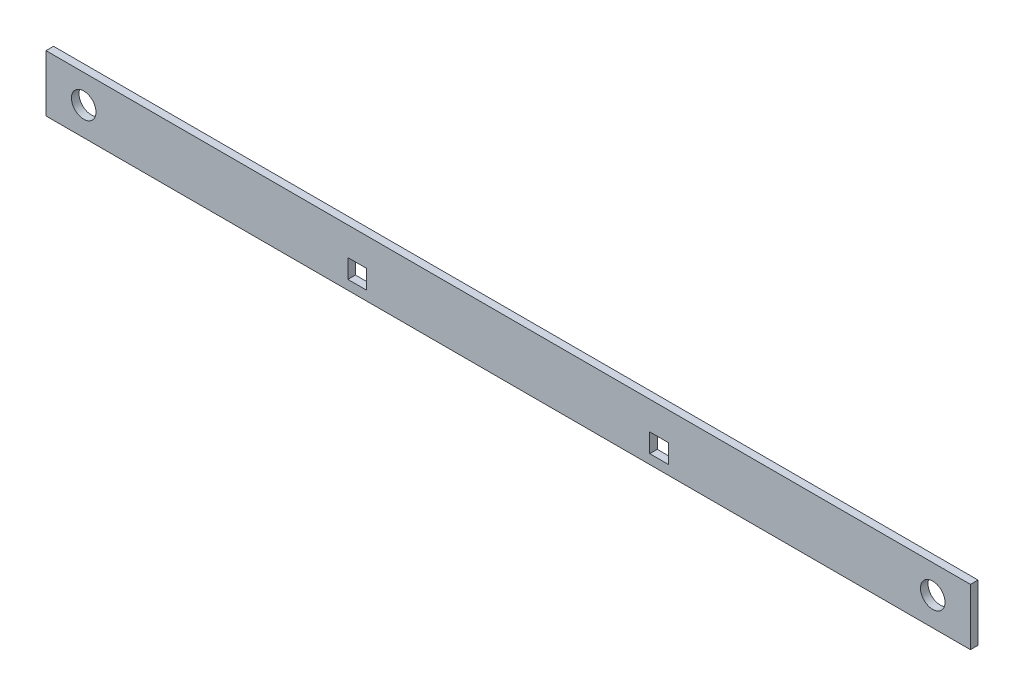
ISO-10303-21;
HEADER;
FILE_DESCRIPTION(('STEP AP214'),'2;1');
FILE_NAME('part.step','',(''),(''),'','','');
FILE_SCHEMA(('AUTOMOTIVE_DESIGN { 1 0 10303 214 1 1 1 1 }'));
ENDSEC;
DATA;
#1=APPLICATION_CONTEXT('core data for automotive mechanical design processes');
#2=APPLICATION_PROTOCOL_DEFINITION('international standard','automotive_design',2000,#1);
#3=PRODUCT_CONTEXT('',#1,'mechanical');
#4=PRODUCT('Part','Part','',(#3));
#5=PRODUCT_RELATED_PRODUCT_CATEGORY('part','',(#4));
#6=PRODUCT_DEFINITION_FORMATION('','',#4);
#7=PRODUCT_DEFINITION_CONTEXT('part definition',#1,'design');
#8=PRODUCT_DEFINITION('design','',#6,#7);
#9=PRODUCT_DEFINITION_SHAPE('','',#8);
#10=(LENGTH_UNIT() NAMED_UNIT(*) SI_UNIT(.MILLI.,.METRE.));
#11=(NAMED_UNIT(*) PLANE_ANGLE_UNIT() SI_UNIT($,.RADIAN.));
#12=(NAMED_UNIT(*) SI_UNIT($,.STERADIAN.) SOLID_ANGLE_UNIT());
#13=UNCERTAINTY_MEASURE_WITH_UNIT(LENGTH_MEASURE(1.E-05),#10,'distance_accuracy_value','');
#14=(GEOMETRIC_REPRESENTATION_CONTEXT(3) GLOBAL_UNCERTAINTY_ASSIGNED_CONTEXT((#13)) GLOBAL_UNIT_ASSIGNED_CONTEXT((#10,
#11,#12)) REPRESENTATION_CONTEXT('',''));
#15=CARTESIAN_POINT('',(0.,0.,0.));
#16=DIRECTION('',(0.,0.,1.));
#17=DIRECTION('',(1.,0.,0.));
#18=AXIS2_PLACEMENT_3D('',#15,#16,#17);
#19=CARTESIAN_POINT('',(0.,0.,2.));
#20=DIRECTION('',(0.,0.,-1.));
#21=DIRECTION('',(-1.,0.,0.));
#22=AXIS2_PLACEMENT_3D('',#19,#20,#21);
#23=PLANE('',#22);
#24=DIRECTION('',(-1.,0.,0.));
#25=VECTOR('',#24,1.);
#26=CARTESIAN_POINT('',(-42.5,0.,2.));
#27=LINE('',#26,#25);
#28=CARTESIAN_POINT('',(-37.5,0.,2.));
#29=VERTEX_POINT('',#28);
#30=CARTESIAN_POINT('',(-42.5,0.,2.));
#31=VERTEX_POINT('',#30);
#32=EDGE_CURVE('E150',#29,#31,#27,.T.);
#33=ORIENTED_EDGE('',*,*,#32,.F.);
#34=DIRECTION('',(0.,1.,0.));
#35=VECTOR('',#34,1.);
#36=CARTESIAN_POINT('',(-37.5,-5.,2.));
#37=LINE('',#36,#35);
#38=CARTESIAN_POINT('',(-37.5,-5.,2.));
#39=VERTEX_POINT('',#38);
#40=EDGE_CURVE('E59',#39,#29,#37,.T.);
#41=ORIENTED_EDGE('',*,*,#40,.F.);
#42=DIRECTION('',(1.,0.,0.));
#43=VECTOR('',#42,1.);
#44=CARTESIAN_POINT('',(-42.5,-5.,2.));
#45=LINE('',#44,#43);
#46=CARTESIAN_POINT('',(-42.5,-5.,2.));
#47=VERTEX_POINT('',#46);
#48=EDGE_CURVE('E157',#47,#39,#45,.T.);
#49=ORIENTED_EDGE('',*,*,#48,.F.);
#50=DIRECTION('',(0.,-1.,0.));
#51=VECTOR('',#50,1.);
#52=CARTESIAN_POINT('',(-42.5,-5.,2.));
#53=LINE('',#52,#51);
#54=EDGE_CURVE('E139',#31,#47,#53,.T.);
#55=ORIENTED_EDGE('',*,*,#54,.F.);
#56=EDGE_LOOP('',(#33,#41,#49,#55));
#57=FACE_BOUND('',#56,.T.);
#58=DIRECTION('',(-1.,0.,0.));
#59=VECTOR('',#58,1.);
#60=CARTESIAN_POINT('',(37.5,0.,2.));
#61=LINE('',#60,#59);
#62=CARTESIAN_POINT('',(42.5,0.,2.));
#63=VERTEX_POINT('',#62);
#64=CARTESIAN_POINT('',(37.5,0.,2.));
#65=VERTEX_POINT('',#64);
#66=EDGE_CURVE('E193',#63,#65,#61,.T.);
#67=ORIENTED_EDGE('',*,*,#66,.F.);
#68=DIRECTION('',(0.,1.,0.));
#69=VECTOR('',#68,1.);
#70=CARTESIAN_POINT('',(42.5,-5.,2.));
#71=LINE('',#70,#69);
#72=CARTESIAN_POINT('',(42.5,-5.,2.));
#73=VERTEX_POINT('',#72);
#74=EDGE_CURVE('E67',#73,#63,#71,.T.);
#75=ORIENTED_EDGE('',*,*,#74,.F.);
#76=DIRECTION('',(1.,0.,0.));
#77=VECTOR('',#76,1.);
#78=CARTESIAN_POINT('',(37.5,-5.,2.));
#79=LINE('',#78,#77);
#80=CARTESIAN_POINT('',(37.5,-5.,2.));
#81=VERTEX_POINT('',#80);
#82=EDGE_CURVE('E176',#81,#73,#79,.T.);
#83=ORIENTED_EDGE('',*,*,#82,.F.);
#84=DIRECTION('',(0.,-1.,0.));
#85=VECTOR('',#84,1.);
#86=CARTESIAN_POINT('',(37.5,-5.,2.));
#87=LINE('',#86,#85);
#88=EDGE_CURVE('E189',#65,#81,#87,.T.);
#89=ORIENTED_EDGE('',*,*,#88,.F.);
#90=EDGE_LOOP('',(#67,#75,#83,#89));
#91=FACE_BOUND('',#90,.T.);
#92=DIRECTION('',(0.,1.,0.));
#93=VECTOR('',#92,1.);
#94=CARTESIAN_POINT('',(122.5,-7.5,2.));
#95=LINE('',#94,#93);
#96=CARTESIAN_POINT('',(122.5,-7.5,2.));
#97=VERTEX_POINT('',#96);
#98=CARTESIAN_POINT('',(122.5,7.5,2.));
#99=VERTEX_POINT('',#98);
#100=EDGE_CURVE('E215',#97,#99,#95,.T.);
#101=ORIENTED_EDGE('',*,*,#100,.T.);
#102=DIRECTION('',(-1.,0.,0.));
#103=VECTOR('',#102,1.);
#104=CARTESIAN_POINT('',(-122.5,7.5,2.));
#105=LINE('',#104,#103);
#106=CARTESIAN_POINT('',(-122.5,7.5,2.));
#107=VERTEX_POINT('',#106);
#108=EDGE_CURVE('E219',#99,#107,#105,.T.);
#109=ORIENTED_EDGE('',*,*,#108,.T.);
#110=DIRECTION('',(0.,-1.,0.));
#111=VECTOR('',#110,1.);
#112=CARTESIAN_POINT('',(-122.5,-7.5,2.));
#113=LINE('',#112,#111);
#114=CARTESIAN_POINT('',(-122.5,-7.5,2.));
#115=VERTEX_POINT('',#114);
#116=EDGE_CURVE('E223',#107,#115,#113,.T.);
#117=ORIENTED_EDGE('',*,*,#116,.T.);
#118=DIRECTION('',(1.,0.,0.));
#119=VECTOR('',#118,1.);
#120=CARTESIAN_POINT('',(-122.5,-7.5,2.));
#121=LINE('',#120,#119);
#122=EDGE_CURVE('E226',#115,#97,#121,.T.);
#123=ORIENTED_EDGE('',*,*,#122,.T.);
#124=EDGE_LOOP('',(#101,#109,#117,#123));
#125=FACE_BOUND('',#124,.T.);
#126=CARTESIAN_POINT('',(-112.5,0.,2.));
#127=DIRECTION('',(0.,0.,1.));
#128=DIRECTION('',(1.,0.,0.));
#129=AXIS2_PLACEMENT_3D('',#126,#127,#128);
#130=CIRCLE('',#129,3.25000000000001);
#131=CARTESIAN_POINT('',(-109.25,0.,2.));
#132=VERTEX_POINT('',#131);
#133=EDGE_CURVE('E207',#132,#132,#130,.T.);
#134=ORIENTED_EDGE('',*,*,#133,.F.);
#135=EDGE_LOOP('',(#134));
#136=FACE_BOUND('',#135,.T.);
#137=CARTESIAN_POINT('',(112.5,0.,2.));
#138=DIRECTION('',(0.,0.,1.));
#139=DIRECTION('',(1.,0.,0.));
#140=AXIS2_PLACEMENT_3D('',#137,#138,#139);
#141=CIRCLE('',#140,3.25000000000001);
#142=CARTESIAN_POINT('',(115.75,0.,2.));
#143=VERTEX_POINT('',#142);
#144=EDGE_CURVE('E199',#143,#143,#141,.T.);
#145=ORIENTED_EDGE('',*,*,#144,.F.);
#146=EDGE_LOOP('',(#145));
#147=FACE_BOUND('',#146,.T.);
#148=ADVANCED_FACE('F43',(#57,#91,#125,#136,#147),#23,.F.);
#149=CARTESIAN_POINT('',(0.,0.,0.));
#150=DIRECTION('',(0.,0.,-1.));
#151=DIRECTION('',(-1.,0.,0.));
#152=AXIS2_PLACEMENT_3D('',#149,#150,#151);
#153=PLANE('',#152);
#154=DIRECTION('',(0.,-1.,0.));
#155=VECTOR('',#154,1.);
#156=CARTESIAN_POINT('',(-37.5,0.,0.));
#157=LINE('',#156,#155);
#158=CARTESIAN_POINT('',(-37.5,0.,0.));
#159=VERTEX_POINT('',#158);
#160=CARTESIAN_POINT('',(-37.5,-5.,0.));
#161=VERTEX_POINT('',#160);
#162=EDGE_CURVE('E11',#159,#161,#157,.T.);
#163=ORIENTED_EDGE('',*,*,#162,.F.);
#164=DIRECTION('',(1.,0.,0.));
#165=VECTOR('',#164,1.);
#166=CARTESIAN_POINT('',(0.,0.,0.));
#167=LINE('',#166,#165);
#168=CARTESIAN_POINT('',(-42.5,0.,0.));
#169=VERTEX_POINT('',#168);
#170=EDGE_CURVE('E268',#169,#159,#167,.T.);
#171=ORIENTED_EDGE('',*,*,#170,.F.);
#172=DIRECTION('',(0.,1.,0.));
#173=VECTOR('',#172,1.);
#174=CARTESIAN_POINT('',(-42.5,0.,0.));
#175=LINE('',#174,#173);
#176=CARTESIAN_POINT('',(-42.5,-5.,0.));
#177=VERTEX_POINT('',#176);
#178=EDGE_CURVE('E142',#177,#169,#175,.T.);
#179=ORIENTED_EDGE('',*,*,#178,.F.);
#180=DIRECTION('',(-1.,0.,0.));
#181=VECTOR('',#180,1.);
#182=CARTESIAN_POINT('',(0.,-5.,0.));
#183=LINE('',#182,#181);
#184=EDGE_CURVE('E52',#161,#177,#183,.T.);
#185=ORIENTED_EDGE('',*,*,#184,.F.);
#186=EDGE_LOOP('',(#163,#171,#179,#185));
#187=FACE_BOUND('',#186,.T.);
#188=DIRECTION('',(0.,-1.,0.));
#189=VECTOR('',#188,1.);
#190=CARTESIAN_POINT('',(42.5,0.,0.));
#191=LINE('',#190,#189);
#192=CARTESIAN_POINT('',(42.5,0.,0.));
#193=VERTEX_POINT('',#192);
#194=CARTESIAN_POINT('',(42.5,-5.,0.));
#195=VERTEX_POINT('',#194);
#196=EDGE_CURVE('E265',#193,#195,#191,.T.);
#197=ORIENTED_EDGE('',*,*,#196,.F.);
#198=DIRECTION('',(1.,0.,0.));
#199=VECTOR('',#198,1.);
#200=CARTESIAN_POINT('',(0.,0.,0.));
#201=LINE('',#200,#199);
#202=CARTESIAN_POINT('',(37.5,0.,0.));
#203=VERTEX_POINT('',#202);
#204=EDGE_CURVE('E256',#203,#193,#201,.T.);
#205=ORIENTED_EDGE('',*,*,#204,.F.);
#206=DIRECTION('',(0.,1.,0.));
#207=VECTOR('',#206,1.);
#208=CARTESIAN_POINT('',(37.5,0.,0.));
#209=LINE('',#208,#207);
#210=CARTESIAN_POINT('',(37.5,-5.,0.));
#211=VERTEX_POINT('',#210);
#212=EDGE_CURVE('E259',#211,#203,#209,.T.);
#213=ORIENTED_EDGE('',*,*,#212,.F.);
#214=DIRECTION('',(-1.,0.,0.));
#215=VECTOR('',#214,1.);
#216=CARTESIAN_POINT('',(0.,-5.,0.));
#217=LINE('',#216,#215);
#218=EDGE_CURVE('E262',#195,#211,#217,.T.);
#219=ORIENTED_EDGE('',*,*,#218,.F.);
#220=EDGE_LOOP('',(#197,#205,#213,#219));
#221=FACE_BOUND('',#220,.T.);
#222=CARTESIAN_POINT('',(-112.5,0.,0.));
#223=DIRECTION('',(0.,0.,1.));
#224=DIRECTION('',(1.,0.,0.));
#225=AXIS2_PLACEMENT_3D('',#222,#223,#224);
#226=CIRCLE('',#225,3.25000000000001);
#227=CARTESIAN_POINT('',(-109.25,0.,0.));
#228=VERTEX_POINT('',#227);
#229=EDGE_CURVE('E203',#228,#228,#226,.T.);
#230=ORIENTED_EDGE('',*,*,#229,.T.);
#231=EDGE_LOOP('',(#230));
#232=FACE_BOUND('',#231,.T.);
#233=DIRECTION('',(0.,1.,0.));
#234=VECTOR('',#233,1.);
#235=CARTESIAN_POINT('',(122.5,-7.5,0.));
#236=LINE('',#235,#234);
#237=CARTESIAN_POINT('',(122.5,-7.5,0.));
#238=VERTEX_POINT('',#237);
#239=CARTESIAN_POINT('',(122.5,7.5,0.));
#240=VERTEX_POINT('',#239);
#241=EDGE_CURVE('E211',#238,#240,#236,.T.);
#242=ORIENTED_EDGE('',*,*,#241,.F.);
#243=DIRECTION('',(1.,0.,0.));
#244=VECTOR('',#243,1.);
#245=CARTESIAN_POINT('',(-122.5,-7.5,0.));
#246=LINE('',#245,#244);
#247=CARTESIAN_POINT('',(-122.5,-7.5,0.));
#248=VERTEX_POINT('',#247);
#249=EDGE_CURVE('E220',#248,#238,#246,.T.);
#250=ORIENTED_EDGE('',*,*,#249,.F.);
#251=DIRECTION('',(0.,-1.,0.));
#252=VECTOR('',#251,1.);
#253=CARTESIAN_POINT('',(-122.5,-7.5,0.));
#254=LINE('',#253,#252);
#255=CARTESIAN_POINT('',(-122.5,7.5,0.));
#256=VERTEX_POINT('',#255);
#257=EDGE_CURVE('E236',#256,#248,#254,.T.);
#258=ORIENTED_EDGE('',*,*,#257,.F.);
#259=DIRECTION('',(-1.,0.,0.));
#260=VECTOR('',#259,1.);
#261=CARTESIAN_POINT('',(-122.5,7.5,0.));
#262=LINE('',#261,#260);
#263=EDGE_CURVE('E233',#240,#256,#262,.T.);
#264=ORIENTED_EDGE('',*,*,#263,.F.);
#265=EDGE_LOOP('',(#242,#250,#258,#264));
#266=FACE_BOUND('',#265,.T.);
#267=CARTESIAN_POINT('',(112.5,0.,0.));
#268=DIRECTION('',(0.,0.,1.));
#269=DIRECTION('',(1.,0.,0.));
#270=AXIS2_PLACEMENT_3D('',#267,#268,#269);
#271=CIRCLE('',#270,3.25000000000001);
#272=CARTESIAN_POINT('',(115.75,0.,0.));
#273=VERTEX_POINT('',#272);
#274=EDGE_CURVE('E168',#273,#273,#271,.T.);
#275=ORIENTED_EDGE('',*,*,#274,.T.);
#276=EDGE_LOOP('',(#275));
#277=FACE_BOUND('',#276,.T.);
#278=ADVANCED_FACE('F280',(#187,#221,#232,#266,#277),#153,.T.);
#279=CARTESIAN_POINT('',(122.5,-7.5,2.));
#280=DIRECTION('',(-1.,0.,0.));
#281=DIRECTION('',(0.,-1.,0.));
#282=AXIS2_PLACEMENT_3D('',#279,#280,#281);
#283=PLANE('',#282);
#284=ORIENTED_EDGE('',*,*,#241,.T.);
#285=DIRECTION('',(0.,0.,-1.));
#286=VECTOR('',#285,1.);
#287=CARTESIAN_POINT('',(122.5,7.5,2.));
#288=LINE('',#287,#286);
#289=EDGE_CURVE('E252',#99,#240,#288,.T.);
#290=ORIENTED_EDGE('',*,*,#289,.F.);
#291=ORIENTED_EDGE('',*,*,#100,.F.);
#292=DIRECTION('',(0.,0.,-1.));
#293=VECTOR('',#292,1.);
#294=CARTESIAN_POINT('',(122.5,-7.5,2.));
#295=LINE('',#294,#293);
#296=EDGE_CURVE('E229',#97,#238,#295,.T.);
#297=ORIENTED_EDGE('',*,*,#296,.T.);
#298=EDGE_LOOP('',(#284,#290,#291,#297));
#299=FACE_BOUND('',#298,.T.);
#300=ADVANCED_FACE('F45',(#299),#283,.F.);
#301=CARTESIAN_POINT('',(-122.5,7.5,2.));
#302=DIRECTION('',(0.,-1.,0.));
#303=DIRECTION('',(0.,0.,-1.));
#304=AXIS2_PLACEMENT_3D('',#301,#302,#303);
#305=PLANE('',#304);
#306=ORIENTED_EDGE('',*,*,#263,.T.);
#307=DIRECTION('',(0.,0.,-1.));
#308=VECTOR('',#307,1.);
#309=CARTESIAN_POINT('',(-122.5,7.5,2.));
#310=LINE('',#309,#308);
#311=EDGE_CURVE('E248',#107,#256,#310,.T.);
#312=ORIENTED_EDGE('',*,*,#311,.F.);
#313=ORIENTED_EDGE('',*,*,#108,.F.);
#314=ORIENTED_EDGE('',*,*,#289,.T.);
#315=EDGE_LOOP('',(#306,#312,#313,#314));
#316=FACE_BOUND('',#315,.T.);
#317=ADVANCED_FACE('F310',(#316),#305,.F.);
#318=CARTESIAN_POINT('',(-122.5,-7.5,2.));
#319=DIRECTION('',(1.,0.,0.));
#320=DIRECTION('',(0.,0.,-1.));
#321=AXIS2_PLACEMENT_3D('',#318,#319,#320);
#322=PLANE('',#321);
#323=ORIENTED_EDGE('',*,*,#257,.T.);
#324=DIRECTION('',(0.,0.,-1.));
#325=VECTOR('',#324,1.);
#326=CARTESIAN_POINT('',(-122.5,-7.5,2.));
#327=LINE('',#326,#325);
#328=EDGE_CURVE('E244',#115,#248,#327,.T.);
#329=ORIENTED_EDGE('',*,*,#328,.F.);
#330=ORIENTED_EDGE('',*,*,#116,.F.);
#331=ORIENTED_EDGE('',*,*,#311,.T.);
#332=EDGE_LOOP('',(#323,#329,#330,#331));
#333=FACE_BOUND('',#332,.T.);
#334=ADVANCED_FACE('F307',(#333),#322,.F.);
#335=CARTESIAN_POINT('',(-122.5,-7.5,2.));
#336=DIRECTION('',(0.,1.,0.));
#337=DIRECTION('',(0.,0.,1.));
#338=AXIS2_PLACEMENT_3D('',#335,#336,#337);
#339=PLANE('',#338);
#340=ORIENTED_EDGE('',*,*,#249,.T.);
#341=ORIENTED_EDGE('',*,*,#296,.F.);
#342=ORIENTED_EDGE('',*,*,#122,.F.);
#343=ORIENTED_EDGE('',*,*,#328,.T.);
#344=EDGE_LOOP('',(#340,#341,#342,#343));
#345=FACE_BOUND('',#344,.T.);
#346=ADVANCED_FACE('F304',(#345),#339,.F.);
#347=CARTESIAN_POINT('',(-112.5,0.,2.));
#348=DIRECTION('',(0.,0.,-1.));
#349=DIRECTION('',(-1.,0.,0.));
#350=AXIS2_PLACEMENT_3D('',#347,#348,#349);
#351=CYLINDRICAL_SURFACE('',#350,3.25000000000001);
#352=ORIENTED_EDGE('',*,*,#133,.T.);
#353=EDGE_LOOP('',(#352));
#354=FACE_BOUND('',#353,.T.);
#355=ORIENTED_EDGE('',*,*,#229,.F.);
#356=EDGE_LOOP('',(#355));
#357=FACE_BOUND('',#356,.T.);
#358=ADVANCED_FACE('F301',(#354,#357),#351,.F.);
#359=CARTESIAN_POINT('',(112.5,0.,2.));
#360=DIRECTION('',(0.,0.,-1.));
#361=DIRECTION('',(-1.,0.,0.));
#362=AXIS2_PLACEMENT_3D('',#359,#360,#361);
#363=CYLINDRICAL_SURFACE('',#362,3.25000000000001);
#364=ORIENTED_EDGE('',*,*,#144,.T.);
#365=EDGE_LOOP('',(#364));
#366=FACE_BOUND('',#365,.T.);
#367=ORIENTED_EDGE('',*,*,#274,.F.);
#368=EDGE_LOOP('',(#367));
#369=FACE_BOUND('',#368,.T.);
#370=ADVANCED_FACE('F335',(#366,#369),#363,.F.);
#371=CARTESIAN_POINT('',(42.5,-5.,-8.));
#372=DIRECTION('',(1.,0.,0.));
#373=DIRECTION('',(0.,0.,-1.));
#374=AXIS2_PLACEMENT_3D('',#371,#372,#373);
#375=PLANE('',#374);
#376=ORIENTED_EDGE('',*,*,#196,.T.);
#377=DIRECTION('',(0.,0.,1.));
#378=VECTOR('',#377,1.);
#379=CARTESIAN_POINT('',(42.5,-5.,-8.));
#380=LINE('',#379,#378);
#381=EDGE_CURVE('E183',#195,#73,#380,.T.);
#382=ORIENTED_EDGE('',*,*,#381,.T.);
#383=ORIENTED_EDGE('',*,*,#74,.T.);
#384=DIRECTION('',(0.,0.,1.));
#385=VECTOR('',#384,1.);
#386=CARTESIAN_POINT('',(42.5,0.,-8.));
#387=LINE('',#386,#385);
#388=EDGE_CURVE('E173',#193,#63,#387,.T.);
#389=ORIENTED_EDGE('',*,*,#388,.F.);
#390=EDGE_LOOP('',(#376,#382,#383,#389));
#391=FACE_BOUND('',#390,.T.);
#392=ADVANCED_FACE('F338',(#391),#375,.F.);
#393=CARTESIAN_POINT('',(37.5,-5.,-8.));
#394=DIRECTION('',(0.,-1.,0.));
#395=DIRECTION('',(0.,0.,-1.));
#396=AXIS2_PLACEMENT_3D('',#393,#394,#395);
#397=PLANE('',#396);
#398=ORIENTED_EDGE('',*,*,#218,.T.);
#399=DIRECTION('',(0.,0.,1.));
#400=VECTOR('',#399,1.);
#401=CARTESIAN_POINT('',(37.5,-5.,-8.));
#402=LINE('',#401,#400);
#403=EDGE_CURVE('E180',#211,#81,#402,.T.);
#404=ORIENTED_EDGE('',*,*,#403,.T.);
#405=ORIENTED_EDGE('',*,*,#82,.T.);
#406=ORIENTED_EDGE('',*,*,#381,.F.);
#407=EDGE_LOOP('',(#398,#404,#405,#406));
#408=FACE_BOUND('',#407,.T.);
#409=ADVANCED_FACE('F343',(#408),#397,.F.);
#410=CARTESIAN_POINT('',(37.5,-5.,-8.));
#411=DIRECTION('',(-1.,0.,0.));
#412=DIRECTION('',(0.,0.,1.));
#413=AXIS2_PLACEMENT_3D('',#410,#411,#412);
#414=PLANE('',#413);
#415=ORIENTED_EDGE('',*,*,#212,.T.);
#416=DIRECTION('',(0.,0.,1.));
#417=VECTOR('',#416,1.);
#418=CARTESIAN_POINT('',(37.5,0.,-8.));
#419=LINE('',#418,#417);
#420=EDGE_CURVE('E177',#203,#65,#419,.T.);
#421=ORIENTED_EDGE('',*,*,#420,.T.);
#422=ORIENTED_EDGE('',*,*,#88,.T.);
#423=ORIENTED_EDGE('',*,*,#403,.F.);
#424=EDGE_LOOP('',(#415,#421,#422,#423));
#425=FACE_BOUND('',#424,.T.);
#426=ADVANCED_FACE('F290',(#425),#414,.F.);
#427=CARTESIAN_POINT('',(37.5,0.,-8.));
#428=DIRECTION('',(0.,1.,0.));
#429=DIRECTION('',(-1.,0.,0.));
#430=AXIS2_PLACEMENT_3D('',#427,#428,#429);
#431=PLANE('',#430);
#432=ORIENTED_EDGE('',*,*,#204,.T.);
#433=ORIENTED_EDGE('',*,*,#388,.T.);
#434=ORIENTED_EDGE('',*,*,#66,.T.);
#435=ORIENTED_EDGE('',*,*,#420,.F.);
#436=EDGE_LOOP('',(#432,#433,#434,#435));
#437=FACE_BOUND('',#436,.T.);
#438=ADVANCED_FACE('F284',(#437),#431,.F.);
#439=CARTESIAN_POINT('',(-37.5,-5.,-8.));
#440=DIRECTION('',(1.,0.,0.));
#441=DIRECTION('',(0.,0.,-1.));
#442=AXIS2_PLACEMENT_3D('',#439,#440,#441);
#443=PLANE('',#442);
#444=ORIENTED_EDGE('',*,*,#162,.T.);
#445=DIRECTION('',(0.,0.,1.));
#446=VECTOR('',#445,1.);
#447=CARTESIAN_POINT('',(-37.5,-5.,-8.));
#448=LINE('',#447,#446);
#449=EDGE_CURVE('E165',#161,#39,#448,.T.);
#450=ORIENTED_EDGE('',*,*,#449,.T.);
#451=ORIENTED_EDGE('',*,*,#40,.T.);
#452=DIRECTION('',(0.,0.,1.));
#453=VECTOR('',#452,1.);
#454=CARTESIAN_POINT('',(-37.5,0.,-8.));
#455=LINE('',#454,#453);
#456=EDGE_CURVE('E147',#159,#29,#455,.T.);
#457=ORIENTED_EDGE('',*,*,#456,.F.);
#458=EDGE_LOOP('',(#444,#450,#451,#457));
#459=FACE_BOUND('',#458,.T.);
#460=ADVANCED_FACE('F282',(#459),#443,.F.);
#461=CARTESIAN_POINT('',(-42.5,-5.,-8.));
#462=DIRECTION('',(0.,-1.,0.));
#463=DIRECTION('',(0.,0.,-1.));
#464=AXIS2_PLACEMENT_3D('',#461,#462,#463);
#465=PLANE('',#464);
#466=ORIENTED_EDGE('',*,*,#184,.T.);
#467=DIRECTION('',(0.,0.,1.));
#468=VECTOR('',#467,1.);
#469=CARTESIAN_POINT('',(-42.5,-5.,-8.));
#470=LINE('',#469,#468);
#471=EDGE_CURVE('E146',#177,#47,#470,.T.);
#472=ORIENTED_EDGE('',*,*,#471,.T.);
#473=ORIENTED_EDGE('',*,*,#48,.T.);
#474=ORIENTED_EDGE('',*,*,#449,.F.);
#475=EDGE_LOOP('',(#466,#472,#473,#474));
#476=FACE_BOUND('',#475,.T.);
#477=ADVANCED_FACE('F277',(#476),#465,.F.);
#478=CARTESIAN_POINT('',(-42.5,-5.,-8.));
#479=DIRECTION('',(-1.,0.,0.));
#480=DIRECTION('',(0.,0.,1.));
#481=AXIS2_PLACEMENT_3D('',#478,#479,#480);
#482=PLANE('',#481);
#483=ORIENTED_EDGE('',*,*,#178,.T.);
#484=DIRECTION('',(0.,0.,1.));
#485=VECTOR('',#484,1.);
#486=CARTESIAN_POINT('',(-42.5,0.,-8.));
#487=LINE('',#486,#485);
#488=EDGE_CURVE('E134',#169,#31,#487,.T.);
#489=ORIENTED_EDGE('',*,*,#488,.T.);
#490=ORIENTED_EDGE('',*,*,#54,.T.);
#491=ORIENTED_EDGE('',*,*,#471,.F.);
#492=EDGE_LOOP('',(#483,#489,#490,#491));
#493=FACE_BOUND('',#492,.T.);
#494=ADVANCED_FACE('F136',(#493),#482,.F.);
#495=CARTESIAN_POINT('',(-42.5,0.,-8.));
#496=DIRECTION('',(0.,1.,0.));
#497=DIRECTION('',(0.,0.,1.));
#498=AXIS2_PLACEMENT_3D('',#495,#496,#497);
#499=PLANE('',#498);
#500=ORIENTED_EDGE('',*,*,#170,.T.);
#501=ORIENTED_EDGE('',*,*,#456,.T.);
#502=ORIENTED_EDGE('',*,*,#32,.T.);
#503=ORIENTED_EDGE('',*,*,#488,.F.);
#504=EDGE_LOOP('',(#500,#501,#502,#503));
#505=FACE_BOUND('',#504,.T.);
#506=ADVANCED_FACE('F151',(#505),#499,.F.);
#507=CLOSED_SHELL('',(#148,#278,#300,#317,#334,#346,#358,#370,#392,#409,#426,#438,#460,#477,
#494,#506));
#508=MANIFOLD_SOLID_BREP('B2',#507);
#509=ADVANCED_BREP_SHAPE_REPRESENTATION('',(#18,#508),#14);
#510=SHAPE_DEFINITION_REPRESENTATION(#9,#509);
ENDSEC;
END-ISO-10303-21;
